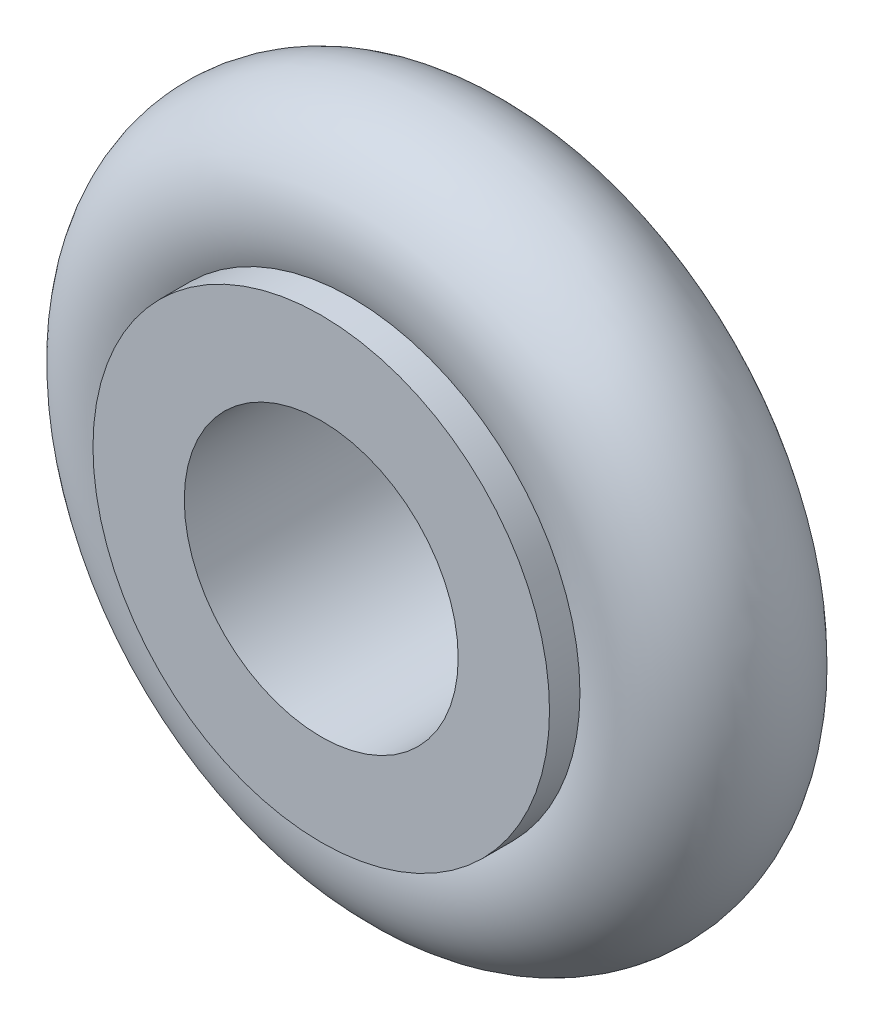
ISO-10303-21;
HEADER;
FILE_DESCRIPTION(('STEP AP214'),'2;1');
FILE_NAME('part.step','',(''),(''),'','','');
FILE_SCHEMA(('AUTOMOTIVE_DESIGN { 1 0 10303 214 1 1 1 1 }'));
ENDSEC;
DATA;
#1=APPLICATION_CONTEXT('core data for automotive mechanical design processes');
#2=APPLICATION_PROTOCOL_DEFINITION('international standard','automotive_design',2000,#1);
#3=PRODUCT_CONTEXT('',#1,'mechanical');
#4=PRODUCT('Part','Part','',(#3));
#5=PRODUCT_RELATED_PRODUCT_CATEGORY('part','',(#4));
#6=PRODUCT_DEFINITION_FORMATION('','',#4);
#7=PRODUCT_DEFINITION_CONTEXT('part definition',#1,'design');
#8=PRODUCT_DEFINITION('design','',#6,#7);
#9=PRODUCT_DEFINITION_SHAPE('','',#8);
#10=(LENGTH_UNIT() NAMED_UNIT(*) SI_UNIT(.MILLI.,.METRE.));
#11=(NAMED_UNIT(*) PLANE_ANGLE_UNIT() SI_UNIT($,.RADIAN.));
#12=(NAMED_UNIT(*) SI_UNIT($,.STERADIAN.) SOLID_ANGLE_UNIT());
#13=UNCERTAINTY_MEASURE_WITH_UNIT(LENGTH_MEASURE(1.E-05),#10,'distance_accuracy_value','');
#14=(GEOMETRIC_REPRESENTATION_CONTEXT(3) GLOBAL_UNCERTAINTY_ASSIGNED_CONTEXT((#13)) GLOBAL_UNIT_ASSIGNED_CONTEXT((#10,
#11,#12)) REPRESENTATION_CONTEXT('',''));
#15=CARTESIAN_POINT('',(0.,0.,0.));
#16=DIRECTION('',(0.,0.,1.));
#17=DIRECTION('',(1.,0.,0.));
#18=AXIS2_PLACEMENT_3D('',#15,#16,#17);
#19=CARTESIAN_POINT('',(0.,0.,0.));
#20=DIRECTION('',(0.,0.,1.));
#21=DIRECTION('',(1.,0.,0.));
#22=AXIS2_PLACEMENT_3D('',#19,#20,#21);
#23=TOROIDAL_SURFACE('',#22,4.28955259373304,1.5);
#24=CARTESIAN_POINT('',(5.78955259373304,0.,0.));
#25=VERTEX_POINT('',#24);
#26=VERTEX_LOOP('',#25);
#27=FACE_BOUND('',#26,.T.);
#28=ADVANCED_FACE('F42',(#27),#23,.T.);
#29=CLOSED_SHELL('',(#28));
#30=MANIFOLD_SOLID_BREP('B2_NOT_SHOWN',#29);
#31=CARTESIAN_POINT('',(0.,0.,-1.9));
#32=DIRECTION('',(0.,0.,-1.));
#33=DIRECTION('',(-1.,0.,0.));
#34=AXIS2_PLACEMENT_3D('',#31,#32,#33);
#35=PLANE('',#34);
#36=CARTESIAN_POINT('',(0.,0.,-1.9));
#37=DIRECTION('',(0.,0.,-1.));
#38=DIRECTION('',(-1.,0.,0.));
#39=AXIS2_PLACEMENT_3D('',#36,#37,#38);
#40=CIRCLE('',#39,2.25);
#41=CARTESIAN_POINT('',(-2.25,0.,-1.9));
#42=VERTEX_POINT('',#41);
#43=EDGE_CURVE('E80',#42,#42,#40,.F.);
#44=ORIENTED_EDGE('',*,*,#43,.T.);
#45=EDGE_LOOP('',(#44));
#46=FACE_BOUND('',#45,.T.);
#47=CARTESIAN_POINT('',(0.,0.,-1.9));
#48=DIRECTION('',(0.,0.,-1.));
#49=DIRECTION('',(-1.,0.,0.));
#50=AXIS2_PLACEMENT_3D('',#47,#48,#49);
#51=CIRCLE('',#50,3.75);
#52=CARTESIAN_POINT('',(-3.75,0.,-1.9));
#53=VERTEX_POINT('',#52);
#54=EDGE_CURVE('E41',#53,#53,#51,.T.);
#55=ORIENTED_EDGE('',*,*,#54,.T.);
#56=EDGE_LOOP('',(#55));
#57=FACE_BOUND('',#56,.T.);
#58=ADVANCED_FACE('F54',(#46,#57),#35,.T.);
#59=CARTESIAN_POINT('',(0.,0.,-6.22705657946134));
#60=DIRECTION('',(0.,0.,-1.));
#61=DIRECTION('',(-1.,0.,0.));
#62=AXIS2_PLACEMENT_3D('',#59,#60,#61);
#63=CYLINDRICAL_SURFACE('',#62,3.75);
#64=CARTESIAN_POINT('',(0.,0.,-1.4));
#65=DIRECTION('',(0.,0.,-1.));
#66=DIRECTION('',(-1.,0.,0.));
#67=AXIS2_PLACEMENT_3D('',#64,#65,#66);
#68=CIRCLE('',#67,3.75);
#69=CARTESIAN_POINT('',(-3.75,0.,-1.4));
#70=VERTEX_POINT('',#69);
#71=EDGE_CURVE('E60',#70,#70,#68,.T.);
#72=ORIENTED_EDGE('',*,*,#71,.T.);
#73=EDGE_LOOP('',(#72));
#74=FACE_BOUND('',#73,.T.);
#75=ORIENTED_EDGE('',*,*,#54,.F.);
#76=EDGE_LOOP('',(#75));
#77=FACE_BOUND('',#76,.T.);
#78=ADVANCED_FACE('F115',(#74,#77),#63,.T.);
#79=CARTESIAN_POINT('',(0.,0.,-1.4));
#80=DIRECTION('',(0.,0.,-1.));
#81=DIRECTION('',(-1.,0.,0.));
#82=AXIS2_PLACEMENT_3D('',#79,#80,#81);
#83=CONICAL_SURFACE('',#82,3.75,1.22522113490003);
#84=CARTESIAN_POINT('',(0.,0.,-1.05));
#85=DIRECTION('',(0.,0.,-1.));
#86=DIRECTION('',(-1.,0.,0.));
#87=AXIS2_PLACEMENT_3D('',#84,#85,#86);
#88=CIRCLE('',#87,2.77783760112974);
#89=CARTESIAN_POINT('',(-2.77783760112974,0.,-1.05));
#90=VERTEX_POINT('',#89);
#91=EDGE_CURVE('E64',#90,#90,#88,.T.);
#92=ORIENTED_EDGE('',*,*,#91,.T.);
#93=EDGE_LOOP('',(#92));
#94=FACE_BOUND('',#93,.T.);
#95=ORIENTED_EDGE('',*,*,#71,.F.);
#96=EDGE_LOOP('',(#95));
#97=FACE_BOUND('',#96,.T.);
#98=ADVANCED_FACE('F109',(#94,#97),#83,.T.);
#99=CARTESIAN_POINT('',(0.,0.,-6.22705657946134));
#100=DIRECTION('',(0.,0.,-1.));
#101=DIRECTION('',(-1.,0.,0.));
#102=AXIS2_PLACEMENT_3D('',#99,#100,#101);
#103=CYLINDRICAL_SURFACE('',#102,2.77783760112974);
#104=CARTESIAN_POINT('',(0.,0.,1.05));
#105=DIRECTION('',(0.,0.,-1.));
#106=DIRECTION('',(-1.,0.,0.));
#107=AXIS2_PLACEMENT_3D('',#104,#105,#106);
#108=CIRCLE('',#107,2.77783760112974);
#109=CARTESIAN_POINT('',(-2.77783760112974,0.,1.05));
#110=VERTEX_POINT('',#109);
#111=EDGE_CURVE('E68',#110,#110,#108,.T.);
#112=ORIENTED_EDGE('',*,*,#111,.T.);
#113=EDGE_LOOP('',(#112));
#114=FACE_BOUND('',#113,.T.);
#115=ORIENTED_EDGE('',*,*,#91,.F.);
#116=EDGE_LOOP('',(#115));
#117=FACE_BOUND('',#116,.T.);
#118=ADVANCED_FACE('F103',(#114,#117),#103,.T.);
#119=CARTESIAN_POINT('',(0.,0.,1.05));
#120=DIRECTION('',(0.,0.,1.));
#121=DIRECTION('',(1.,0.,0.));
#122=AXIS2_PLACEMENT_3D('',#119,#120,#121);
#123=CONICAL_SURFACE('',#122,2.77783760112974,1.22522113490003);
#124=CARTESIAN_POINT('',(0.,0.,1.4));
#125=DIRECTION('',(0.,0.,-1.));
#126=DIRECTION('',(-1.,0.,0.));
#127=AXIS2_PLACEMENT_3D('',#124,#125,#126);
#128=CIRCLE('',#127,3.75);
#129=CARTESIAN_POINT('',(-3.75,0.,1.4));
#130=VERTEX_POINT('',#129);
#131=EDGE_CURVE('E73',#130,#130,#128,.T.);
#132=ORIENTED_EDGE('',*,*,#131,.T.);
#133=EDGE_LOOP('',(#132));
#134=FACE_BOUND('',#133,.T.);
#135=ORIENTED_EDGE('',*,*,#111,.F.);
#136=EDGE_LOOP('',(#135));
#137=FACE_BOUND('',#136,.T.);
#138=ADVANCED_FACE('F97',(#134,#137),#123,.T.);
#139=CARTESIAN_POINT('',(0.,0.,-6.22705657946134));
#140=DIRECTION('',(0.,0.,-1.));
#141=DIRECTION('',(-1.,0.,0.));
#142=AXIS2_PLACEMENT_3D('',#139,#140,#141);
#143=CYLINDRICAL_SURFACE('',#142,3.75);
#144=CARTESIAN_POINT('',(0.,0.,1.9));
#145=DIRECTION('',(0.,0.,-1.));
#146=DIRECTION('',(-1.,0.,0.));
#147=AXIS2_PLACEMENT_3D('',#144,#145,#146);
#148=CIRCLE('',#147,3.75);
#149=CARTESIAN_POINT('',(-3.75,0.,1.9));
#150=VERTEX_POINT('',#149);
#151=EDGE_CURVE('E76',#150,#150,#148,.T.);
#152=ORIENTED_EDGE('',*,*,#151,.T.);
#153=EDGE_LOOP('',(#152));
#154=FACE_BOUND('',#153,.T.);
#155=ORIENTED_EDGE('',*,*,#131,.F.);
#156=EDGE_LOOP('',(#155));
#157=FACE_BOUND('',#156,.T.);
#158=ADVANCED_FACE('F91',(#154,#157),#143,.T.);
#159=CARTESIAN_POINT('',(0.,0.,1.9));
#160=DIRECTION('',(0.,0.,1.));
#161=DIRECTION('',(1.,0.,0.));
#162=AXIS2_PLACEMENT_3D('',#159,#160,#161);
#163=PLANE('',#162);
#164=CARTESIAN_POINT('',(0.,0.,1.9));
#165=DIRECTION('',(0.,0.,1.));
#166=DIRECTION('',(1.,0.,0.));
#167=AXIS2_PLACEMENT_3D('',#164,#165,#166);
#168=CIRCLE('',#167,2.25);
#169=CARTESIAN_POINT('',(2.25,0.,1.9));
#170=VERTEX_POINT('',#169);
#171=EDGE_CURVE('E79',#170,#170,#168,.T.);
#172=ORIENTED_EDGE('',*,*,#171,.F.);
#173=EDGE_LOOP('',(#172));
#174=FACE_BOUND('',#173,.T.);
#175=ORIENTED_EDGE('',*,*,#151,.F.);
#176=EDGE_LOOP('',(#175));
#177=FACE_BOUND('',#176,.T.);
#178=ADVANCED_FACE('F88',(#174,#177),#163,.T.);
#179=CARTESIAN_POINT('',(0.,0.,-1.901));
#180=DIRECTION('',(0.,0.,1.));
#181=DIRECTION('',(1.,0.,0.));
#182=AXIS2_PLACEMENT_3D('',#179,#180,#181);
#183=CYLINDRICAL_SURFACE('',#182,2.25);
#184=ORIENTED_EDGE('',*,*,#43,.F.);
#185=EDGE_LOOP('',(#184));
#186=FACE_BOUND('',#185,.T.);
#187=ORIENTED_EDGE('',*,*,#171,.T.);
#188=EDGE_LOOP('',(#187));
#189=FACE_BOUND('',#188,.T.);
#190=ADVANCED_FACE('F86',(#186,#189),#183,.F.);
#191=CLOSED_SHELL('',(#58,#78,#98,#118,#138,#158,#178,#190));
#192=MANIFOLD_SOLID_BREP('B6',#191);
#193=ADVANCED_BREP_SHAPE_REPRESENTATION('',(#18,#30,#192),#14);
#194=SHAPE_DEFINITION_REPRESENTATION(#9,#193);
ENDSEC;
END-ISO-10303-21;
